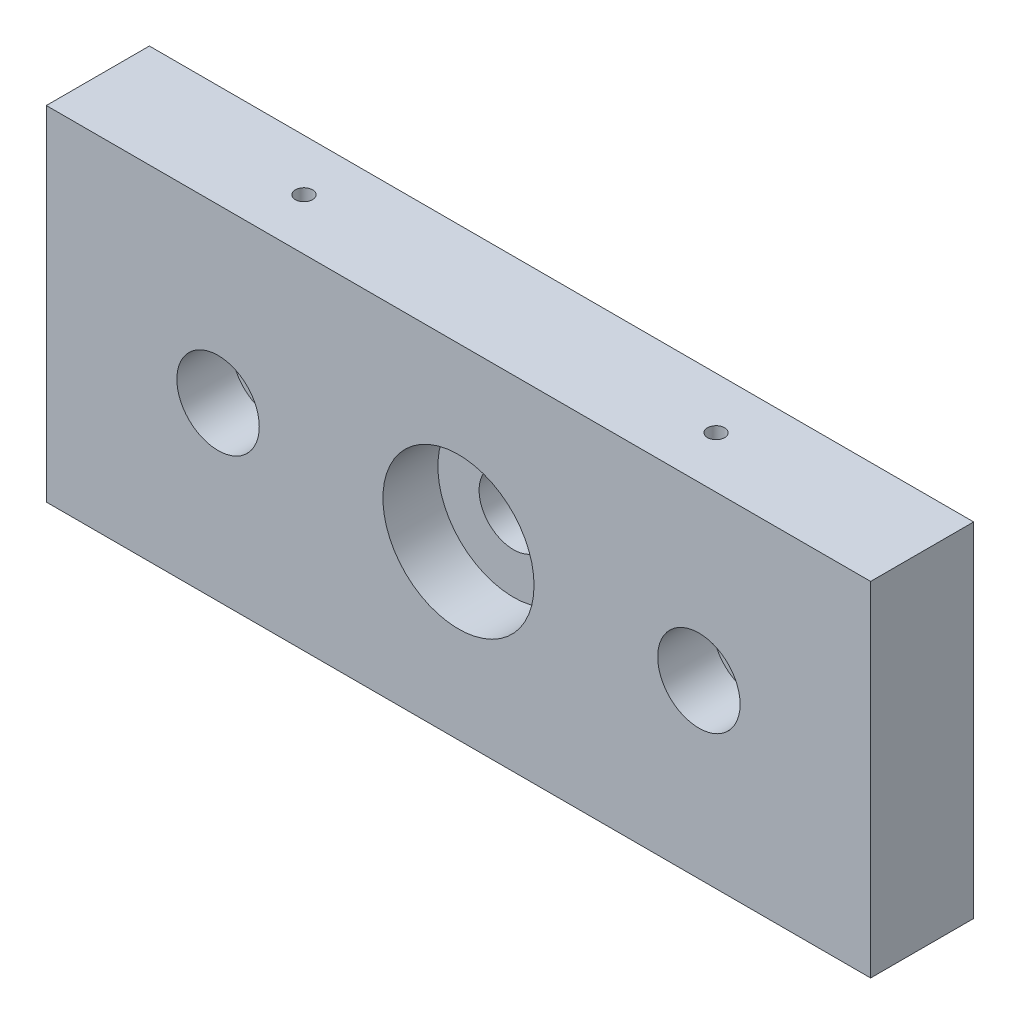
ISO-10303-21;
HEADER;
FILE_DESCRIPTION(('STEP AP214'),'2;1');
FILE_NAME('part.step','',(''),(''),'','','');
FILE_SCHEMA(('AUTOMOTIVE_DESIGN { 1 0 10303 214 1 1 1 1 }'));
ENDSEC;
DATA;
#1=APPLICATION_CONTEXT('core data for automotive mechanical design processes');
#2=APPLICATION_PROTOCOL_DEFINITION('international standard','automotive_design',2000,#1);
#3=PRODUCT_CONTEXT('',#1,'mechanical');
#4=PRODUCT('Part','Part','',(#3));
#5=PRODUCT_RELATED_PRODUCT_CATEGORY('part','',(#4));
#6=PRODUCT_DEFINITION_FORMATION('','',#4);
#7=PRODUCT_DEFINITION_CONTEXT('part definition',#1,'design');
#8=PRODUCT_DEFINITION('design','',#6,#7);
#9=PRODUCT_DEFINITION_SHAPE('','',#8);
#10=(LENGTH_UNIT() NAMED_UNIT(*) SI_UNIT(.MILLI.,.METRE.));
#11=(NAMED_UNIT(*) PLANE_ANGLE_UNIT() SI_UNIT($,.RADIAN.));
#12=(NAMED_UNIT(*) SI_UNIT($,.STERADIAN.) SOLID_ANGLE_UNIT());
#13=UNCERTAINTY_MEASURE_WITH_UNIT(LENGTH_MEASURE(1.E-05),#10,'distance_accuracy_value','');
#14=(GEOMETRIC_REPRESENTATION_CONTEXT(3) GLOBAL_UNCERTAINTY_ASSIGNED_CONTEXT((#13)) GLOBAL_UNIT_ASSIGNED_CONTEXT((#10,
#11,#12)) REPRESENTATION_CONTEXT('',''));
#15=CARTESIAN_POINT('',(0.,0.,0.));
#16=DIRECTION('',(0.,0.,1.));
#17=DIRECTION('',(1.,0.,0.));
#18=AXIS2_PLACEMENT_3D('',#15,#16,#17);
#19=CARTESIAN_POINT('',(-60.,-25.,15.));
#20=DIRECTION('',(1.,0.,0.));
#21=DIRECTION('',(0.,0.,-1.));
#22=AXIS2_PLACEMENT_3D('',#19,#20,#21);
#23=PLANE('',#22);
#24=DIRECTION('',(0.,-1.,0.));
#25=VECTOR('',#24,1.);
#26=CARTESIAN_POINT('',(-60.,-25.,0.));
#27=LINE('',#26,#25);
#28=CARTESIAN_POINT('',(-60.,25.,0.));
#29=VERTEX_POINT('',#28);
#30=CARTESIAN_POINT('',(-60.,-25.,0.));
#31=VERTEX_POINT('',#30);
#32=EDGE_CURVE('E163',#29,#31,#27,.T.);
#33=ORIENTED_EDGE('',*,*,#32,.T.);
#34=DIRECTION('',(0.,0.,-1.));
#35=VECTOR('',#34,1.);
#36=CARTESIAN_POINT('',(-60.,-25.,15.));
#37=LINE('',#36,#35);
#38=CARTESIAN_POINT('',(-60.,-25.,15.));
#39=VERTEX_POINT('',#38);
#40=EDGE_CURVE('E11',#39,#31,#37,.T.);
#41=ORIENTED_EDGE('',*,*,#40,.F.);
#42=DIRECTION('',(0.,-1.,0.));
#43=VECTOR('',#42,1.);
#44=CARTESIAN_POINT('',(-60.,-25.,15.));
#45=LINE('',#44,#43);
#46=CARTESIAN_POINT('',(-60.,25.,15.));
#47=VERTEX_POINT('',#46);
#48=EDGE_CURVE('E166',#47,#39,#45,.T.);
#49=ORIENTED_EDGE('',*,*,#48,.F.);
#50=DIRECTION('',(0.,0.,-1.));
#51=VECTOR('',#50,1.);
#52=CARTESIAN_POINT('',(-60.,25.,15.));
#53=LINE('',#52,#51);
#54=EDGE_CURVE('E172',#47,#29,#53,.T.);
#55=ORIENTED_EDGE('',*,*,#54,.T.);
#56=EDGE_LOOP('',(#33,#41,#49,#55));
#57=FACE_BOUND('',#56,.T.);
#58=ADVANCED_FACE('F36',(#57),#23,.F.);
#59=CARTESIAN_POINT('',(-60.,-25.,15.));
#60=DIRECTION('',(0.,1.,0.));
#61=DIRECTION('',(0.,0.,1.));
#62=AXIS2_PLACEMENT_3D('',#59,#60,#61);
#63=PLANE('',#62);
#64=CARTESIAN_POINT('',(30.,-25.,7.5));
#65=DIRECTION('',(0.,-1.,0.));
#66=DIRECTION('',(0.,0.,-1.));
#67=AXIS2_PLACEMENT_3D('',#64,#65,#66);
#68=CIRCLE('',#67,1.24999999999999);
#69=CARTESIAN_POINT('',(30.,-25.,6.25000000000001));
#70=VERTEX_POINT('',#69);
#71=EDGE_CURVE('E107',#70,#70,#68,.T.);
#72=ORIENTED_EDGE('',*,*,#71,.F.);
#73=EDGE_LOOP('',(#72));
#74=FACE_BOUND('',#73,.T.);
#75=CARTESIAN_POINT('',(-30.,-25.,7.50000000000003));
#76=DIRECTION('',(0.,-1.,0.));
#77=DIRECTION('',(0.,0.,-1.));
#78=AXIS2_PLACEMENT_3D('',#75,#76,#77);
#79=CIRCLE('',#78,1.24999999999999);
#80=CARTESIAN_POINT('',(-30.,-25.,6.25000000000004));
#81=VERTEX_POINT('',#80);
#82=EDGE_CURVE('E106',#81,#81,#79,.T.);
#83=ORIENTED_EDGE('',*,*,#82,.F.);
#84=EDGE_LOOP('',(#83));
#85=FACE_BOUND('',#84,.T.);
#86=DIRECTION('',(1.,0.,0.));
#87=VECTOR('',#86,1.);
#88=CARTESIAN_POINT('',(-60.,-25.,0.));
#89=LINE('',#88,#87);
#90=CARTESIAN_POINT('',(60.,-25.,0.));
#91=VERTEX_POINT('',#90);
#92=EDGE_CURVE('E175',#31,#91,#89,.T.);
#93=ORIENTED_EDGE('',*,*,#92,.T.);
#94=DIRECTION('',(0.,0.,-1.));
#95=VECTOR('',#94,1.);
#96=CARTESIAN_POINT('',(60.,-25.,15.));
#97=LINE('',#96,#95);
#98=CARTESIAN_POINT('',(60.,-25.,15.));
#99=VERTEX_POINT('',#98);
#100=EDGE_CURVE('E44',#99,#91,#97,.T.);
#101=ORIENTED_EDGE('',*,*,#100,.F.);
#102=DIRECTION('',(1.,0.,0.));
#103=VECTOR('',#102,1.);
#104=CARTESIAN_POINT('',(-60.,-25.,15.));
#105=LINE('',#104,#103);
#106=EDGE_CURVE('E83',#39,#99,#105,.T.);
#107=ORIENTED_EDGE('',*,*,#106,.F.);
#108=ORIENTED_EDGE('',*,*,#40,.T.);
#109=EDGE_LOOP('',(#93,#101,#107,#108));
#110=FACE_BOUND('',#109,.T.);
#111=ADVANCED_FACE('F200',(#74,#85,#110),#63,.F.);
#112=CARTESIAN_POINT('',(60.,-25.,15.));
#113=DIRECTION('',(-1.,0.,0.));
#114=DIRECTION('',(0.,0.,1.));
#115=AXIS2_PLACEMENT_3D('',#112,#113,#114);
#116=PLANE('',#115);
#117=DIRECTION('',(0.,1.,0.));
#118=VECTOR('',#117,1.);
#119=CARTESIAN_POINT('',(60.,-25.,0.));
#120=LINE('',#119,#118);
#121=CARTESIAN_POINT('',(60.,25.,0.));
#122=VERTEX_POINT('',#121);
#123=EDGE_CURVE('E70',#91,#122,#120,.T.);
#124=ORIENTED_EDGE('',*,*,#123,.T.);
#125=DIRECTION('',(0.,0.,-1.));
#126=VECTOR('',#125,1.);
#127=CARTESIAN_POINT('',(60.,25.,15.));
#128=LINE('',#127,#126);
#129=CARTESIAN_POINT('',(60.,25.,15.));
#130=VERTEX_POINT('',#129);
#131=EDGE_CURVE('E180',#130,#122,#128,.T.);
#132=ORIENTED_EDGE('',*,*,#131,.F.);
#133=DIRECTION('',(0.,1.,0.));
#134=VECTOR('',#133,1.);
#135=CARTESIAN_POINT('',(60.,-25.,15.));
#136=LINE('',#135,#134);
#137=EDGE_CURVE('E169',#99,#130,#136,.T.);
#138=ORIENTED_EDGE('',*,*,#137,.F.);
#139=ORIENTED_EDGE('',*,*,#100,.T.);
#140=EDGE_LOOP('',(#124,#132,#138,#139));
#141=FACE_BOUND('',#140,.T.);
#142=ADVANCED_FACE('F182',(#141),#116,.F.);
#143=CARTESIAN_POINT('',(-60.,25.,15.));
#144=DIRECTION('',(0.,-1.,0.));
#145=DIRECTION('',(0.,0.,-1.));
#146=AXIS2_PLACEMENT_3D('',#143,#144,#145);
#147=PLANE('',#146);
#148=CARTESIAN_POINT('',(30.,25.,7.5));
#149=DIRECTION('',(0.,1.,0.));
#150=DIRECTION('',(0.,0.,1.));
#151=AXIS2_PLACEMENT_3D('',#148,#149,#150);
#152=CIRCLE('',#151,1.24999999999999);
#153=CARTESIAN_POINT('',(30.,25.,8.74999999999999));
#154=VERTEX_POINT('',#153);
#155=EDGE_CURVE('E117',#154,#154,#152,.T.);
#156=ORIENTED_EDGE('',*,*,#155,.F.);
#157=EDGE_LOOP('',(#156));
#158=FACE_BOUND('',#157,.T.);
#159=CARTESIAN_POINT('',(-30.,25.,7.50000000000003));
#160=DIRECTION('',(0.,1.,0.));
#161=DIRECTION('',(0.,0.,1.));
#162=AXIS2_PLACEMENT_3D('',#159,#160,#161);
#163=CIRCLE('',#162,1.24999999999999);
#164=CARTESIAN_POINT('',(-30.,25.,8.75000000000002));
#165=VERTEX_POINT('',#164);
#166=EDGE_CURVE('E123',#165,#165,#163,.T.);
#167=ORIENTED_EDGE('',*,*,#166,.F.);
#168=EDGE_LOOP('',(#167));
#169=FACE_BOUND('',#168,.T.);
#170=DIRECTION('',(-1.,0.,0.));
#171=VECTOR('',#170,1.);
#172=CARTESIAN_POINT('',(-60.,25.,0.));
#173=LINE('',#172,#171);
#174=EDGE_CURVE('E76',#122,#29,#173,.T.);
#175=ORIENTED_EDGE('',*,*,#174,.T.);
#176=ORIENTED_EDGE('',*,*,#54,.F.);
#177=DIRECTION('',(-1.,0.,0.));
#178=VECTOR('',#177,1.);
#179=CARTESIAN_POINT('',(-60.,25.,15.));
#180=LINE('',#179,#178);
#181=EDGE_CURVE('E52',#130,#47,#180,.T.);
#182=ORIENTED_EDGE('',*,*,#181,.F.);
#183=ORIENTED_EDGE('',*,*,#131,.T.);
#184=EDGE_LOOP('',(#175,#176,#182,#183));
#185=FACE_BOUND('',#184,.T.);
#186=ADVANCED_FACE('F189',(#158,#169,#185),#147,.F.);
#187=CARTESIAN_POINT('',(0.,0.,15.));
#188=DIRECTION('',(0.,0.,-1.));
#189=DIRECTION('',(-1.,0.,0.));
#190=AXIS2_PLACEMENT_3D('',#187,#188,#189);
#191=PLANE('',#190);
#192=CARTESIAN_POINT('',(0.,0.,15.));
#193=DIRECTION('',(0.,0.,1.));
#194=DIRECTION('',(1.,0.,0.));
#195=AXIS2_PLACEMENT_3D('',#192,#193,#194);
#196=CIRCLE('',#195,11.);
#197=CARTESIAN_POINT('',(11.,0.,15.));
#198=VERTEX_POINT('',#197);
#199=EDGE_CURVE('E147',#198,#198,#196,.T.);
#200=ORIENTED_EDGE('',*,*,#199,.F.);
#201=EDGE_LOOP('',(#200));
#202=FACE_BOUND('',#201,.T.);
#203=CARTESIAN_POINT('',(35.,0.,15.));
#204=DIRECTION('',(0.,0.,1.));
#205=DIRECTION('',(1.,0.,0.));
#206=AXIS2_PLACEMENT_3D('',#203,#204,#205);
#207=CIRCLE('',#206,6.);
#208=CARTESIAN_POINT('',(41.,0.,15.));
#209=VERTEX_POINT('',#208);
#210=EDGE_CURVE('E151',#209,#209,#207,.T.);
#211=ORIENTED_EDGE('',*,*,#210,.F.);
#212=EDGE_LOOP('',(#211));
#213=FACE_BOUND('',#212,.T.);
#214=CARTESIAN_POINT('',(-35.,0.,15.));
#215=DIRECTION('',(0.,0.,1.));
#216=DIRECTION('',(1.,0.,0.));
#217=AXIS2_PLACEMENT_3D('',#214,#215,#216);
#218=CIRCLE('',#217,6.);
#219=CARTESIAN_POINT('',(-29.,0.,15.));
#220=VERTEX_POINT('',#219);
#221=EDGE_CURVE('E157',#220,#220,#218,.T.);
#222=ORIENTED_EDGE('',*,*,#221,.F.);
#223=EDGE_LOOP('',(#222));
#224=FACE_BOUND('',#223,.T.);
#225=ORIENTED_EDGE('',*,*,#48,.T.);
#226=ORIENTED_EDGE('',*,*,#106,.T.);
#227=ORIENTED_EDGE('',*,*,#137,.T.);
#228=ORIENTED_EDGE('',*,*,#181,.T.);
#229=EDGE_LOOP('',(#225,#226,#227,#228));
#230=FACE_BOUND('',#229,.T.);
#231=ADVANCED_FACE('F191',(#202,#213,#224,#230),#191,.F.);
#232=CARTESIAN_POINT('',(0.,0.,0.));
#233=DIRECTION('',(0.,0.,-1.));
#234=DIRECTION('',(-1.,0.,0.));
#235=AXIS2_PLACEMENT_3D('',#232,#233,#234);
#236=PLANE('',#235);
#237=CARTESIAN_POINT('',(0.,0.,0.));
#238=DIRECTION('',(0.,0.,-1.));
#239=DIRECTION('',(-1.,0.,0.));
#240=AXIS2_PLACEMENT_3D('',#237,#238,#239);
#241=CIRCLE('',#240,5.);
#242=CARTESIAN_POINT('',(-5.,0.,0.));
#243=VERTEX_POINT('',#242);
#244=EDGE_CURVE('E132',#243,#243,#241,.T.);
#245=ORIENTED_EDGE('',*,*,#244,.F.);
#246=EDGE_LOOP('',(#245));
#247=FACE_BOUND('',#246,.T.);
#248=CARTESIAN_POINT('',(35.,0.,0.));
#249=DIRECTION('',(0.,0.,-1.));
#250=DIRECTION('',(-1.,0.,0.));
#251=AXIS2_PLACEMENT_3D('',#248,#249,#250);
#252=CIRCLE('',#251,3.25000000000001);
#253=CARTESIAN_POINT('',(31.75,0.,0.));
#254=VERTEX_POINT('',#253);
#255=EDGE_CURVE('E138',#254,#254,#252,.T.);
#256=ORIENTED_EDGE('',*,*,#255,.F.);
#257=EDGE_LOOP('',(#256));
#258=FACE_BOUND('',#257,.T.);
#259=CARTESIAN_POINT('',(-35.,0.,0.));
#260=DIRECTION('',(0.,0.,-1.));
#261=DIRECTION('',(-1.,0.,0.));
#262=AXIS2_PLACEMENT_3D('',#259,#260,#261);
#263=CIRCLE('',#262,3.25);
#264=CARTESIAN_POINT('',(-38.25,0.,0.));
#265=VERTEX_POINT('',#264);
#266=EDGE_CURVE('E144',#265,#265,#263,.T.);
#267=ORIENTED_EDGE('',*,*,#266,.F.);
#268=EDGE_LOOP('',(#267));
#269=FACE_BOUND('',#268,.T.);
#270=ORIENTED_EDGE('',*,*,#32,.F.);
#271=ORIENTED_EDGE('',*,*,#174,.F.);
#272=ORIENTED_EDGE('',*,*,#123,.F.);
#273=ORIENTED_EDGE('',*,*,#92,.F.);
#274=EDGE_LOOP('',(#270,#271,#272,#273));
#275=FACE_BOUND('',#274,.T.);
#276=ADVANCED_FACE('F185',(#247,#258,#269,#275),#236,.T.);
#277=CARTESIAN_POINT('',(-35.,0.,7.));
#278=DIRECTION('',(0.,0.,1.));
#279=DIRECTION('',(1.,0.,0.));
#280=AXIS2_PLACEMENT_3D('',#277,#278,#279);
#281=CYLINDRICAL_SURFACE('',#280,6.);
#282=CARTESIAN_POINT('',(-35.,0.,7.));
#283=DIRECTION('',(0.,0.,1.));
#284=DIRECTION('',(1.,0.,0.));
#285=AXIS2_PLACEMENT_3D('',#282,#283,#284);
#286=CIRCLE('',#285,6.);
#287=CARTESIAN_POINT('',(-29.,0.,7.));
#288=VERTEX_POINT('',#287);
#289=EDGE_CURVE('E160',#288,#288,#286,.T.);
#290=ORIENTED_EDGE('',*,*,#289,.F.);
#291=EDGE_LOOP('',(#290));
#292=FACE_BOUND('',#291,.T.);
#293=ORIENTED_EDGE('',*,*,#221,.T.);
#294=EDGE_LOOP('',(#293));
#295=FACE_BOUND('',#294,.T.);
#296=ADVANCED_FACE('F275',(#292,#295),#281,.F.);
#297=CARTESIAN_POINT('',(-35.,0.,7.));
#298=DIRECTION('',(0.,0.,1.));
#299=DIRECTION('',(1.,0.,0.));
#300=AXIS2_PLACEMENT_3D('',#297,#298,#299);
#301=PLANE('',#300);
#302=CARTESIAN_POINT('',(-35.,0.,7.));
#303=DIRECTION('',(0.,0.,1.));
#304=DIRECTION('',(1.,0.,0.));
#305=AXIS2_PLACEMENT_3D('',#302,#303,#304);
#306=CIRCLE('',#305,3.25);
#307=CARTESIAN_POINT('',(-31.75,0.,7.));
#308=VERTEX_POINT('',#307);
#309=EDGE_CURVE('E141',#308,#308,#306,.T.);
#310=ORIENTED_EDGE('',*,*,#309,.F.);
#311=EDGE_LOOP('',(#310));
#312=FACE_BOUND('',#311,.T.);
#313=ORIENTED_EDGE('',*,*,#289,.T.);
#314=EDGE_LOOP('',(#313));
#315=FACE_BOUND('',#314,.T.);
#316=ADVANCED_FACE('F271',(#312,#315),#301,.T.);
#317=CARTESIAN_POINT('',(35.,0.,7.));
#318=DIRECTION('',(0.,0.,1.));
#319=DIRECTION('',(1.,0.,0.));
#320=AXIS2_PLACEMENT_3D('',#317,#318,#319);
#321=CYLINDRICAL_SURFACE('',#320,6.);
#322=CARTESIAN_POINT('',(35.,0.,7.));
#323=DIRECTION('',(0.,0.,1.));
#324=DIRECTION('',(1.,0.,0.));
#325=AXIS2_PLACEMENT_3D('',#322,#323,#324);
#326=CIRCLE('',#325,6.);
#327=CARTESIAN_POINT('',(41.,0.,7.));
#328=VERTEX_POINT('',#327);
#329=EDGE_CURVE('E154',#328,#328,#326,.T.);
#330=ORIENTED_EDGE('',*,*,#329,.F.);
#331=EDGE_LOOP('',(#330));
#332=FACE_BOUND('',#331,.T.);
#333=ORIENTED_EDGE('',*,*,#210,.T.);
#334=EDGE_LOOP('',(#333));
#335=FACE_BOUND('',#334,.T.);
#336=ADVANCED_FACE('F267',(#332,#335),#321,.F.);
#337=CARTESIAN_POINT('',(35.,0.,7.));
#338=DIRECTION('',(0.,0.,1.));
#339=DIRECTION('',(1.,0.,0.));
#340=AXIS2_PLACEMENT_3D('',#337,#338,#339);
#341=PLANE('',#340);
#342=CARTESIAN_POINT('',(35.,0.,7.));
#343=DIRECTION('',(0.,0.,1.));
#344=DIRECTION('',(1.,0.,0.));
#345=AXIS2_PLACEMENT_3D('',#342,#343,#344);
#346=CIRCLE('',#345,3.25000000000001);
#347=CARTESIAN_POINT('',(38.25,0.,7.));
#348=VERTEX_POINT('',#347);
#349=EDGE_CURVE('E135',#348,#348,#346,.T.);
#350=ORIENTED_EDGE('',*,*,#349,.F.);
#351=EDGE_LOOP('',(#350));
#352=FACE_BOUND('',#351,.T.);
#353=ORIENTED_EDGE('',*,*,#329,.T.);
#354=EDGE_LOOP('',(#353));
#355=FACE_BOUND('',#354,.T.);
#356=ADVANCED_FACE('F263',(#352,#355),#341,.T.);
#357=CARTESIAN_POINT('',(0.,0.,7.));
#358=DIRECTION('',(0.,0.,1.));
#359=DIRECTION('',(1.,0.,0.));
#360=AXIS2_PLACEMENT_3D('',#357,#358,#359);
#361=CYLINDRICAL_SURFACE('',#360,11.);
#362=CARTESIAN_POINT('',(0.,0.,7.));
#363=DIRECTION('',(0.,0.,1.));
#364=DIRECTION('',(1.,0.,0.));
#365=AXIS2_PLACEMENT_3D('',#362,#363,#364);
#366=CIRCLE('',#365,11.);
#367=CARTESIAN_POINT('',(11.,0.,7.));
#368=VERTEX_POINT('',#367);
#369=EDGE_CURVE('E148',#368,#368,#366,.T.);
#370=ORIENTED_EDGE('',*,*,#369,.F.);
#371=EDGE_LOOP('',(#370));
#372=FACE_BOUND('',#371,.T.);
#373=ORIENTED_EDGE('',*,*,#199,.T.);
#374=EDGE_LOOP('',(#373));
#375=FACE_BOUND('',#374,.T.);
#376=ADVANCED_FACE('F259',(#372,#375),#361,.F.);
#377=CARTESIAN_POINT('',(0.,0.,7.));
#378=DIRECTION('',(0.,0.,1.));
#379=DIRECTION('',(1.,0.,0.));
#380=AXIS2_PLACEMENT_3D('',#377,#378,#379);
#381=PLANE('',#380);
#382=CARTESIAN_POINT('',(0.,0.,7.));
#383=DIRECTION('',(0.,0.,1.));
#384=DIRECTION('',(1.,0.,0.));
#385=AXIS2_PLACEMENT_3D('',#382,#383,#384);
#386=CIRCLE('',#385,5.);
#387=CARTESIAN_POINT('',(5.,0.,7.));
#388=VERTEX_POINT('',#387);
#389=EDGE_CURVE('E129',#388,#388,#386,.T.);
#390=ORIENTED_EDGE('',*,*,#389,.F.);
#391=EDGE_LOOP('',(#390));
#392=FACE_BOUND('',#391,.T.);
#393=ORIENTED_EDGE('',*,*,#369,.T.);
#394=EDGE_LOOP('',(#393));
#395=FACE_BOUND('',#394,.T.);
#396=ADVANCED_FACE('F255',(#392,#395),#381,.T.);
#397=CARTESIAN_POINT('',(-35.,0.,-3.));
#398=DIRECTION('',(0.,0.,1.));
#399=DIRECTION('',(1.,0.,0.));
#400=AXIS2_PLACEMENT_3D('',#397,#398,#399);
#401=CYLINDRICAL_SURFACE('',#400,3.25);
#402=ORIENTED_EDGE('',*,*,#266,.T.);
#403=EDGE_LOOP('',(#402));
#404=FACE_BOUND('',#403,.T.);
#405=ORIENTED_EDGE('',*,*,#309,.T.);
#406=EDGE_LOOP('',(#405));
#407=FACE_BOUND('',#406,.T.);
#408=ADVANCED_FACE('F251',(#404,#407),#401,.F.);
#409=CARTESIAN_POINT('',(35.,0.,-3.));
#410=DIRECTION('',(0.,0.,1.));
#411=DIRECTION('',(1.,0.,0.));
#412=AXIS2_PLACEMENT_3D('',#409,#410,#411);
#413=CYLINDRICAL_SURFACE('',#412,3.25000000000001);
#414=ORIENTED_EDGE('',*,*,#255,.T.);
#415=EDGE_LOOP('',(#414));
#416=FACE_BOUND('',#415,.T.);
#417=ORIENTED_EDGE('',*,*,#349,.T.);
#418=EDGE_LOOP('',(#417));
#419=FACE_BOUND('',#418,.T.);
#420=ADVANCED_FACE('F247',(#416,#419),#413,.F.);
#421=CARTESIAN_POINT('',(0.,0.,-3.));
#422=DIRECTION('',(0.,0.,1.));
#423=DIRECTION('',(1.,0.,0.));
#424=AXIS2_PLACEMENT_3D('',#421,#422,#423);
#425=CYLINDRICAL_SURFACE('',#424,5.);
#426=ORIENTED_EDGE('',*,*,#244,.T.);
#427=EDGE_LOOP('',(#426));
#428=FACE_BOUND('',#427,.T.);
#429=ORIENTED_EDGE('',*,*,#389,.T.);
#430=EDGE_LOOP('',(#429));
#431=FACE_BOUND('',#430,.T.);
#432=ADVANCED_FACE('F243',(#428,#431),#425,.F.);
#433=CARTESIAN_POINT('',(-30.,20.,7.50000000000003));
#434=DIRECTION('',(0.,1.,0.));
#435=DIRECTION('',(0.,0.,1.));
#436=AXIS2_PLACEMENT_3D('',#433,#434,#435);
#437=CONICAL_SURFACE('',#436,1.25,1.02974425867665);
#438=CARTESIAN_POINT('',(-30.,19.2489242262155,7.50000000000003));
#439=VERTEX_POINT('',#438);
#440=VERTEX_LOOP('',#439);
#441=FACE_BOUND('',#440,.T.);
#442=CARTESIAN_POINT('',(-30.,20.,7.50000000000003));
#443=DIRECTION('',(0.,1.,0.));
#444=DIRECTION('',(0.,0.,1.));
#445=AXIS2_PLACEMENT_3D('',#442,#443,#444);
#446=CIRCLE('',#445,1.25);
#447=CARTESIAN_POINT('',(-30.,20.,8.75000000000002));
#448=VERTEX_POINT('',#447);
#449=EDGE_CURVE('E126',#448,#448,#446,.T.);
#450=ORIENTED_EDGE('',*,*,#449,.T.);
#451=EDGE_LOOP('',(#450));
#452=FACE_BOUND('',#451,.T.);
#453=ADVANCED_FACE('F239',(#441,#452),#437,.F.);
#454=CARTESIAN_POINT('',(-30.,25.,7.50000000000003));
#455=DIRECTION('',(0.,1.,0.));
#456=DIRECTION('',(0.,0.,1.));
#457=AXIS2_PLACEMENT_3D('',#454,#455,#456);
#458=CYLINDRICAL_SURFACE('',#457,1.24999999999999);
#459=ORIENTED_EDGE('',*,*,#449,.F.);
#460=EDGE_LOOP('',(#459));
#461=FACE_BOUND('',#460,.T.);
#462=ORIENTED_EDGE('',*,*,#166,.T.);
#463=EDGE_LOOP('',(#462));
#464=FACE_BOUND('',#463,.T.);
#465=ADVANCED_FACE('F235',(#461,#464),#458,.F.);
#466=CARTESIAN_POINT('',(30.,20.,7.5));
#467=DIRECTION('',(0.,1.,0.));
#468=DIRECTION('',(0.,0.,1.));
#469=AXIS2_PLACEMENT_3D('',#466,#467,#468);
#470=CONICAL_SURFACE('',#469,1.25,1.02974425867665);
#471=CARTESIAN_POINT('',(30.,19.2489242262155,7.5));
#472=VERTEX_POINT('',#471);
#473=VERTEX_LOOP('',#472);
#474=FACE_BOUND('',#473,.T.);
#475=CARTESIAN_POINT('',(30.,20.,7.5));
#476=DIRECTION('',(0.,1.,0.));
#477=DIRECTION('',(0.,0.,1.));
#478=AXIS2_PLACEMENT_3D('',#475,#476,#477);
#479=CIRCLE('',#478,1.25);
#480=CARTESIAN_POINT('',(30.,20.,8.75));
#481=VERTEX_POINT('',#480);
#482=EDGE_CURVE('E120',#481,#481,#479,.T.);
#483=ORIENTED_EDGE('',*,*,#482,.T.);
#484=EDGE_LOOP('',(#483));
#485=FACE_BOUND('',#484,.T.);
#486=ADVANCED_FACE('F231',(#474,#485),#470,.F.);
#487=CARTESIAN_POINT('',(30.,25.,7.5));
#488=DIRECTION('',(0.,1.,0.));
#489=DIRECTION('',(0.,0.,1.));
#490=AXIS2_PLACEMENT_3D('',#487,#488,#489);
#491=CYLINDRICAL_SURFACE('',#490,1.24999999999999);
#492=ORIENTED_EDGE('',*,*,#482,.F.);
#493=EDGE_LOOP('',(#492));
#494=FACE_BOUND('',#493,.T.);
#495=ORIENTED_EDGE('',*,*,#155,.T.);
#496=EDGE_LOOP('',(#495));
#497=FACE_BOUND('',#496,.T.);
#498=ADVANCED_FACE('F223',(#494,#497),#491,.F.);
#499=CARTESIAN_POINT('',(-30.,-20.,7.50000000000003));
#500=DIRECTION('',(0.,-1.,0.));
#501=DIRECTION('',(0.,0.,-1.));
#502=AXIS2_PLACEMENT_3D('',#499,#500,#501);
#503=CONICAL_SURFACE('',#502,1.25,1.02974425867665);
#504=CARTESIAN_POINT('',(-30.,-19.2489242262156,7.50000000000003));
#505=VERTEX_POINT('',#504);
#506=VERTEX_LOOP('',#505);
#507=FACE_BOUND('',#506,.T.);
#508=CARTESIAN_POINT('',(-30.,-20.,7.50000000000003));
#509=DIRECTION('',(0.,-1.,0.));
#510=DIRECTION('',(0.,0.,-1.));
#511=AXIS2_PLACEMENT_3D('',#508,#509,#510);
#512=CIRCLE('',#511,1.25);
#513=CARTESIAN_POINT('',(-30.,-20.,6.25000000000003));
#514=VERTEX_POINT('',#513);
#515=EDGE_CURVE('E110',#514,#514,#512,.T.);
#516=ORIENTED_EDGE('',*,*,#515,.T.);
#517=EDGE_LOOP('',(#516));
#518=FACE_BOUND('',#517,.T.);
#519=ADVANCED_FACE('F217',(#507,#518),#503,.F.);
#520=CARTESIAN_POINT('',(-30.,-25.,7.50000000000003));
#521=DIRECTION('',(0.,-1.,0.));
#522=DIRECTION('',(0.,0.,-1.));
#523=AXIS2_PLACEMENT_3D('',#520,#521,#522);
#524=CYLINDRICAL_SURFACE('',#523,1.24999999999999);
#525=ORIENTED_EDGE('',*,*,#515,.F.);
#526=EDGE_LOOP('',(#525));
#527=FACE_BOUND('',#526,.T.);
#528=ORIENTED_EDGE('',*,*,#82,.T.);
#529=EDGE_LOOP('',(#528));
#530=FACE_BOUND('',#529,.T.);
#531=ADVANCED_FACE('F100',(#527,#530),#524,.F.);
#532=CARTESIAN_POINT('',(30.,-20.,7.5));
#533=DIRECTION('',(0.,-1.,0.));
#534=DIRECTION('',(0.,0.,-1.));
#535=AXIS2_PLACEMENT_3D('',#532,#533,#534);
#536=CONICAL_SURFACE('',#535,1.25,1.02974425867665);
#537=CARTESIAN_POINT('',(30.,-19.2489242262156,7.5));
#538=VERTEX_POINT('',#537);
#539=VERTEX_LOOP('',#538);
#540=FACE_BOUND('',#539,.T.);
#541=CARTESIAN_POINT('',(30.,-20.,7.5));
#542=DIRECTION('',(0.,-1.,0.));
#543=DIRECTION('',(0.,0.,-1.));
#544=AXIS2_PLACEMENT_3D('',#541,#542,#543);
#545=CIRCLE('',#544,1.25);
#546=CARTESIAN_POINT('',(30.,-20.,6.25));
#547=VERTEX_POINT('',#546);
#548=EDGE_CURVE('E104',#547,#547,#545,.T.);
#549=ORIENTED_EDGE('',*,*,#548,.T.);
#550=EDGE_LOOP('',(#549));
#551=FACE_BOUND('',#550,.T.);
#552=ADVANCED_FACE('F96',(#540,#551),#536,.F.);
#553=CARTESIAN_POINT('',(30.,-25.,7.5));
#554=DIRECTION('',(0.,-1.,0.));
#555=DIRECTION('',(0.,0.,-1.));
#556=AXIS2_PLACEMENT_3D('',#553,#554,#555);
#557=CYLINDRICAL_SURFACE('',#556,1.24999999999999);
#558=ORIENTED_EDGE('',*,*,#548,.F.);
#559=EDGE_LOOP('',(#558));
#560=FACE_BOUND('',#559,.T.);
#561=ORIENTED_EDGE('',*,*,#71,.T.);
#562=EDGE_LOOP('',(#561));
#563=FACE_BOUND('',#562,.T.);
#564=ADVANCED_FACE('F99',(#560,#563),#557,.F.);
#565=CLOSED_SHELL('',(#58,#111,#142,#186,#231,#276,#296,#316,#336,#356,#376,#396,#408,#420,#432,
#453,#465,#486,#498,#519,#531,#552,#564));
#566=MANIFOLD_SOLID_BREP('B2',#565);
#567=ADVANCED_BREP_SHAPE_REPRESENTATION('',(#18,#566),#14);
#568=SHAPE_DEFINITION_REPRESENTATION(#9,#567);
ENDSEC;
END-ISO-10303-21;
